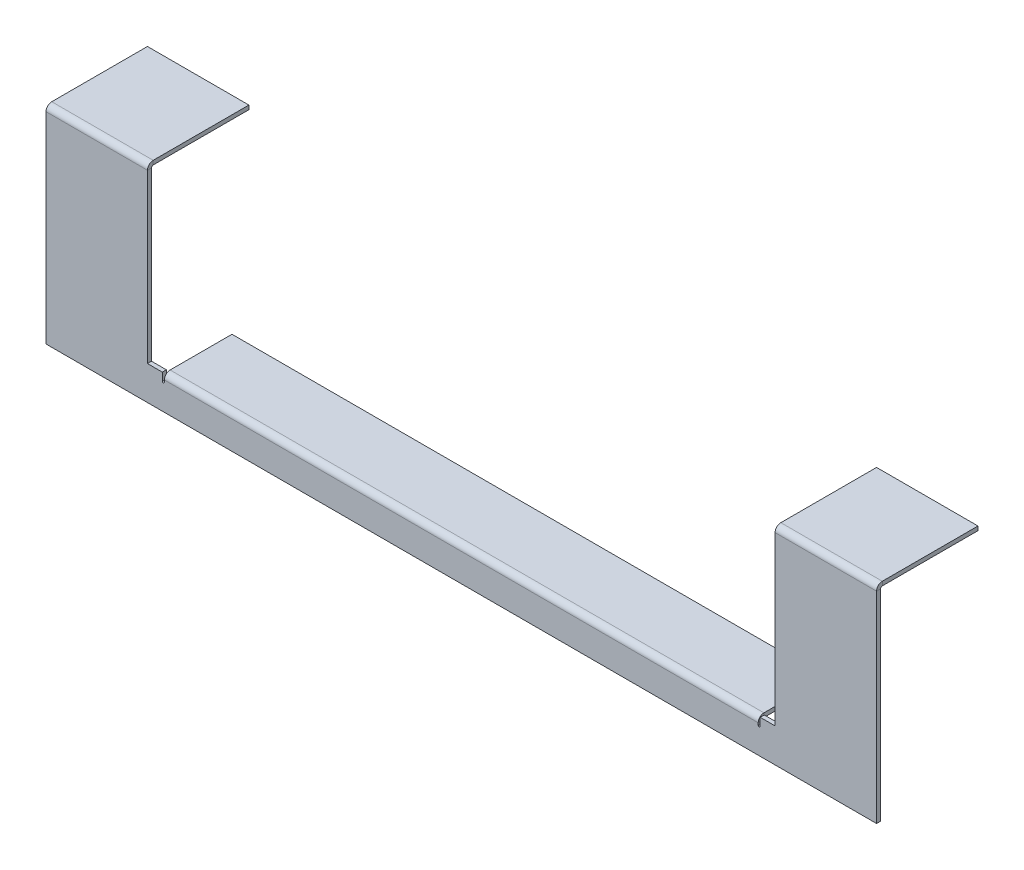
ISO-10303-21;
HEADER;
FILE_DESCRIPTION(('STEP AP214'),'2;1');
FILE_NAME('part.step','',(''),(''),'','','');
FILE_SCHEMA(('AUTOMOTIVE_DESIGN { 1 0 10303 214 1 1 1 1 }'));
ENDSEC;
DATA;
#1=APPLICATION_CONTEXT('core data for automotive mechanical design processes');
#2=APPLICATION_PROTOCOL_DEFINITION('international standard','automotive_design',2000,#1);
#3=PRODUCT_CONTEXT('',#1,'mechanical');
#4=PRODUCT('Part','Part','',(#3));
#5=PRODUCT_RELATED_PRODUCT_CATEGORY('part','',(#4));
#6=PRODUCT_DEFINITION_FORMATION('','',#4);
#7=PRODUCT_DEFINITION_CONTEXT('part definition',#1,'design');
#8=PRODUCT_DEFINITION('design','',#6,#7);
#9=PRODUCT_DEFINITION_SHAPE('','',#8);
#10=(LENGTH_UNIT() NAMED_UNIT(*) SI_UNIT(.MILLI.,.METRE.));
#11=(NAMED_UNIT(*) PLANE_ANGLE_UNIT() SI_UNIT($,.RADIAN.));
#12=(NAMED_UNIT(*) SI_UNIT($,.STERADIAN.) SOLID_ANGLE_UNIT());
#13=UNCERTAINTY_MEASURE_WITH_UNIT(LENGTH_MEASURE(1.E-05),#10,'distance_accuracy_value','');
#14=(GEOMETRIC_REPRESENTATION_CONTEXT(3) GLOBAL_UNCERTAINTY_ASSIGNED_CONTEXT((#13)) GLOBAL_UNIT_ASSIGNED_CONTEXT((#10,
#11,#12)) REPRESENTATION_CONTEXT('',''));
#15=CARTESIAN_POINT('',(0.,0.,0.));
#16=DIRECTION('',(0.,0.,1.));
#17=DIRECTION('',(1.,0.,0.));
#18=AXIS2_PLACEMENT_3D('',#15,#16,#17);
#19=CARTESIAN_POINT('',(0.,0.,-1.2));
#20=DIRECTION('',(0.,0.,1.));
#21=DIRECTION('',(1.,0.,0.));
#22=AXIS2_PLACEMENT_3D('',#19,#20,#21);
#23=PLANE('',#22);
#24=DIRECTION('',(0.,-1.,0.));
#25=VECTOR('',#24,1.);
#26=CARTESIAN_POINT('',(88.4,-20.6,-1.2));
#27=LINE('',#26,#25);
#28=CARTESIAN_POINT('',(88.4,-20.6,-1.2));
#29=VERTEX_POINT('',#28);
#30=CARTESIAN_POINT('',(88.4,-22.9,-1.2));
#31=VERTEX_POINT('',#30);
#32=EDGE_CURVE('E349',#29,#31,#27,.T.);
#33=ORIENTED_EDGE('',*,*,#32,.F.);
#34=DIRECTION('',(1.,0.,0.));
#35=VECTOR('',#34,1.);
#36=CARTESIAN_POINT('',(0.,-20.6,-1.2));
#37=LINE('',#36,#35);
#38=CARTESIAN_POINT('',(92.8,-20.6,-1.2));
#39=VERTEX_POINT('',#38);
#40=EDGE_CURVE('E506',#29,#39,#37,.T.);
#41=ORIENTED_EDGE('',*,*,#40,.T.);
#42=DIRECTION('',(0.,1.,0.));
#43=VECTOR('',#42,1.);
#44=CARTESIAN_POINT('',(92.8,0.,-1.2));
#45=LINE('',#44,#43);
#46=CARTESIAN_POINT('',(92.8,28.9,-1.19999999999999));
#47=VERTEX_POINT('',#46);
#48=EDGE_CURVE('E512',#39,#47,#45,.T.);
#49=ORIENTED_EDGE('',*,*,#48,.T.);
#50=DIRECTION('',(1.,0.,0.));
#51=VECTOR('',#50,1.);
#52=CARTESIAN_POINT('',(122.8,28.9,-1.19999999999999));
#53=LINE('',#52,#51);
#54=CARTESIAN_POINT('',(122.8,28.9,-1.19999999999999));
#55=VERTEX_POINT('',#54);
#56=EDGE_CURVE('E485',#55,#47,#53,.F.);
#57=ORIENTED_EDGE('',*,*,#56,.F.);
#58=DIRECTION('',(0.,1.,0.));
#59=VECTOR('',#58,1.);
#60=CARTESIAN_POINT('',(122.8,-30.6,-1.2));
#61=LINE('',#60,#59);
#62=CARTESIAN_POINT('',(122.8,-30.6,-1.2));
#63=VERTEX_POINT('',#62);
#64=EDGE_CURVE('E521',#63,#55,#61,.T.);
#65=ORIENTED_EDGE('',*,*,#64,.F.);
#66=DIRECTION('',(1.,0.,0.));
#67=VECTOR('',#66,1.);
#68=CARTESIAN_POINT('',(-122.8,-30.6,-1.2));
#69=LINE('',#68,#67);
#70=CARTESIAN_POINT('',(-122.8,-30.6,-1.2));
#71=VERTEX_POINT('',#70);
#72=EDGE_CURVE('E518',#71,#63,#69,.T.);
#73=ORIENTED_EDGE('',*,*,#72,.F.);
#74=DIRECTION('',(0.,-1.,0.));
#75=VECTOR('',#74,1.);
#76=CARTESIAN_POINT('',(-122.8,-30.6,-1.2));
#77=LINE('',#76,#75);
#78=CARTESIAN_POINT('',(-122.8,28.9,-1.2));
#79=VERTEX_POINT('',#78);
#80=EDGE_CURVE('E525',#79,#71,#77,.T.);
#81=ORIENTED_EDGE('',*,*,#80,.F.);
#82=DIRECTION('',(1.,0.,0.));
#83=VECTOR('',#82,1.);
#84=CARTESIAN_POINT('',(-92.8,28.9,-1.2));
#85=LINE('',#84,#83);
#86=CARTESIAN_POINT('',(-92.8,28.9,-1.2));
#87=VERTEX_POINT('',#86);
#88=EDGE_CURVE('E430',#87,#79,#85,.F.);
#89=ORIENTED_EDGE('',*,*,#88,.F.);
#90=DIRECTION('',(0.,-1.,0.));
#91=VECTOR('',#90,1.);
#92=CARTESIAN_POINT('',(-92.8,0.,-1.2));
#93=LINE('',#92,#91);
#94=CARTESIAN_POINT('',(-92.8,-20.6,-1.2));
#95=VERTEX_POINT('',#94);
#96=EDGE_CURVE('E515',#87,#95,#93,.T.);
#97=ORIENTED_EDGE('',*,*,#96,.T.);
#98=CARTESIAN_POINT('',(-88.4,-20.6,-1.2));
#99=VERTEX_POINT('',#98);
#100=EDGE_CURVE('E509',#95,#99,#37,.T.);
#101=ORIENTED_EDGE('',*,*,#100,.T.);
#102=DIRECTION('',(0.,1.,0.));
#103=VECTOR('',#102,1.);
#104=CARTESIAN_POINT('',(-88.4,-22.9,-1.2));
#105=LINE('',#104,#103);
#106=CARTESIAN_POINT('',(-88.4,-22.9,-1.2));
#107=VERTEX_POINT('',#106);
#108=EDGE_CURVE('E365',#107,#99,#105,.T.);
#109=ORIENTED_EDGE('',*,*,#108,.F.);
#110=CARTESIAN_POINT('',(-88.1,-22.9,-1.2));
#111=DIRECTION('',(0.,0.,-1.));
#112=DIRECTION('',(-1.,0.,0.));
#113=AXIS2_PLACEMENT_3D('',#110,#111,#112);
#114=CIRCLE('',#113,0.300000000000002);
#115=CARTESIAN_POINT('',(-87.8,-22.9,-1.2));
#116=VERTEX_POINT('',#115);
#117=EDGE_CURVE('E361',#116,#107,#114,.T.);
#118=ORIENTED_EDGE('',*,*,#117,.F.);
#119=DIRECTION('',(0.,-1.,0.));
#120=VECTOR('',#119,1.);
#121=CARTESIAN_POINT('',(-87.8,-22.3,-1.2));
#122=LINE('',#121,#120);
#123=CARTESIAN_POINT('',(-87.8,-22.3,-1.2));
#124=VERTEX_POINT('',#123);
#125=EDGE_CURVE('E358',#124,#116,#122,.T.);
#126=ORIENTED_EDGE('',*,*,#125,.F.);
#127=DIRECTION('',(1.,0.,0.));
#128=VECTOR('',#127,1.);
#129=CARTESIAN_POINT('',(87.8,-22.3,-1.2));
#130=LINE('',#129,#128);
#131=CARTESIAN_POINT('',(87.8,-22.3,-1.2));
#132=VERTEX_POINT('',#131);
#133=EDGE_CURVE('E338',#132,#124,#130,.F.);
#134=ORIENTED_EDGE('',*,*,#133,.F.);
#135=DIRECTION('',(0.,1.,0.));
#136=VECTOR('',#135,1.);
#137=CARTESIAN_POINT('',(87.8,-22.9,-1.2));
#138=LINE('',#137,#136);
#139=CARTESIAN_POINT('',(87.8,-22.9,-1.2));
#140=VERTEX_POINT('',#139);
#141=EDGE_CURVE('E119',#140,#132,#138,.T.);
#142=ORIENTED_EDGE('',*,*,#141,.F.);
#143=CARTESIAN_POINT('',(88.1,-22.9,-1.2));
#144=DIRECTION('',(0.,0.,-1.));
#145=DIRECTION('',(-1.,0.,0.));
#146=AXIS2_PLACEMENT_3D('',#143,#144,#145);
#147=CIRCLE('',#146,0.300000000000002);
#148=EDGE_CURVE('E114',#31,#140,#147,.T.);
#149=ORIENTED_EDGE('',*,*,#148,.F.);
#150=EDGE_LOOP('',(#33,#41,#49,#57,#65,#73,#81,#89,#97,#101,#109,#118,#126,#134,#142,#149));
#151=FACE_BOUND('',#150,.T.);
#152=ADVANCED_FACE('F99',(#151),#23,.F.);
#153=CARTESIAN_POINT('',(0.,0.,0.));
#154=DIRECTION('',(0.,0.,1.));
#155=DIRECTION('',(1.,0.,0.));
#156=AXIS2_PLACEMENT_3D('',#153,#154,#155);
#157=PLANE('',#156);
#158=DIRECTION('',(1.,0.,0.));
#159=VECTOR('',#158,1.);
#160=CARTESIAN_POINT('',(-92.8,-20.6,0.));
#161=LINE('',#160,#159);
#162=CARTESIAN_POINT('',(88.4,-20.6,0.));
#163=VERTEX_POINT('',#162);
#164=CARTESIAN_POINT('',(92.8,-20.6,0.));
#165=VERTEX_POINT('',#164);
#166=EDGE_CURVE('E496',#163,#165,#161,.T.);
#167=ORIENTED_EDGE('',*,*,#166,.F.);
#168=DIRECTION('',(0.,-1.,0.));
#169=VECTOR('',#168,1.);
#170=CARTESIAN_POINT('',(88.4,0.,0.));
#171=LINE('',#170,#169);
#172=CARTESIAN_POINT('',(88.4,-22.9,0.));
#173=VERTEX_POINT('',#172);
#174=EDGE_CURVE('E382',#163,#173,#171,.T.);
#175=ORIENTED_EDGE('',*,*,#174,.T.);
#176=CARTESIAN_POINT('',(88.1,-22.9,0.));
#177=DIRECTION('',(0.,0.,1.));
#178=DIRECTION('',(1.,0.,0.));
#179=AXIS2_PLACEMENT_3D('',#176,#177,#178);
#180=CIRCLE('',#179,0.300000000000002);
#181=CARTESIAN_POINT('',(87.8,-22.9,0.));
#182=VERTEX_POINT('',#181);
#183=EDGE_CURVE('E13',#173,#182,#180,.F.);
#184=ORIENTED_EDGE('',*,*,#183,.T.);
#185=DIRECTION('',(0.,1.,0.));
#186=VECTOR('',#185,1.);
#187=CARTESIAN_POINT('',(87.8,0.,0.));
#188=LINE('',#187,#186);
#189=CARTESIAN_POINT('',(87.8,-22.3,0.));
#190=VERTEX_POINT('',#189);
#191=EDGE_CURVE('E107',#182,#190,#188,.T.);
#192=ORIENTED_EDGE('',*,*,#191,.T.);
#193=DIRECTION('',(1.,0.,0.));
#194=VECTOR('',#193,1.);
#195=CARTESIAN_POINT('',(87.8,-22.3,0.));
#196=LINE('',#195,#194);
#197=CARTESIAN_POINT('',(-87.8,-22.3,0.));
#198=VERTEX_POINT('',#197);
#199=EDGE_CURVE('E325',#190,#198,#196,.F.);
#200=ORIENTED_EDGE('',*,*,#199,.T.);
#201=DIRECTION('',(0.,-1.,0.));
#202=VECTOR('',#201,1.);
#203=CARTESIAN_POINT('',(-87.8,0.,0.));
#204=LINE('',#203,#202);
#205=CARTESIAN_POINT('',(-87.8,-22.9,0.));
#206=VERTEX_POINT('',#205);
#207=EDGE_CURVE('E540',#198,#206,#204,.T.);
#208=ORIENTED_EDGE('',*,*,#207,.T.);
#209=CARTESIAN_POINT('',(-88.1,-22.9,0.));
#210=DIRECTION('',(0.,0.,1.));
#211=DIRECTION('',(1.,0.,0.));
#212=AXIS2_PLACEMENT_3D('',#209,#210,#211);
#213=CIRCLE('',#212,0.300000000000002);
#214=CARTESIAN_POINT('',(-88.4,-22.9,0.));
#215=VERTEX_POINT('',#214);
#216=EDGE_CURVE('E537',#206,#215,#213,.F.);
#217=ORIENTED_EDGE('',*,*,#216,.T.);
#218=DIRECTION('',(0.,1.,0.));
#219=VECTOR('',#218,1.);
#220=CARTESIAN_POINT('',(-88.4,0.,0.));
#221=LINE('',#220,#219);
#222=CARTESIAN_POINT('',(-88.4,-20.6,0.));
#223=VERTEX_POINT('',#222);
#224=EDGE_CURVE('E352',#215,#223,#221,.T.);
#225=ORIENTED_EDGE('',*,*,#224,.T.);
#226=CARTESIAN_POINT('',(-92.8,-20.6,0.));
#227=VERTEX_POINT('',#226);
#228=EDGE_CURVE('E497',#227,#223,#161,.T.);
#229=ORIENTED_EDGE('',*,*,#228,.F.);
#230=DIRECTION('',(0.,-1.,0.));
#231=VECTOR('',#230,1.);
#232=CARTESIAN_POINT('',(-92.8,30.6,0.));
#233=LINE('',#232,#231);
#234=CARTESIAN_POINT('',(-92.8,28.9,0.));
#235=VERTEX_POINT('',#234);
#236=EDGE_CURVE('E492',#235,#227,#233,.T.);
#237=ORIENTED_EDGE('',*,*,#236,.F.);
#238=DIRECTION('',(1.,0.,0.));
#239=VECTOR('',#238,1.);
#240=CARTESIAN_POINT('',(-92.8,28.9,0.));
#241=LINE('',#240,#239);
#242=CARTESIAN_POINT('',(-122.8,28.9,0.));
#243=VERTEX_POINT('',#242);
#244=EDGE_CURVE('E417',#235,#243,#241,.F.);
#245=ORIENTED_EDGE('',*,*,#244,.T.);
#246=DIRECTION('',(0.,-1.,0.));
#247=VECTOR('',#246,1.);
#248=CARTESIAN_POINT('',(-122.8,-30.6,0.));
#249=LINE('',#248,#247);
#250=CARTESIAN_POINT('',(-122.8,-30.6,0.));
#251=VERTEX_POINT('',#250);
#252=EDGE_CURVE('E522',#243,#251,#249,.T.);
#253=ORIENTED_EDGE('',*,*,#252,.T.);
#254=DIRECTION('',(1.,0.,0.));
#255=VECTOR('',#254,1.);
#256=CARTESIAN_POINT('',(-122.8,-30.6,0.));
#257=LINE('',#256,#255);
#258=CARTESIAN_POINT('',(122.8,-30.6,0.));
#259=VERTEX_POINT('',#258);
#260=EDGE_CURVE('E517',#251,#259,#257,.T.);
#261=ORIENTED_EDGE('',*,*,#260,.T.);
#262=DIRECTION('',(0.,1.,0.));
#263=VECTOR('',#262,1.);
#264=CARTESIAN_POINT('',(122.8,-30.6,0.));
#265=LINE('',#264,#263);
#266=CARTESIAN_POINT('',(122.8,28.9,0.));
#267=VERTEX_POINT('',#266);
#268=EDGE_CURVE('E530',#259,#267,#265,.T.);
#269=ORIENTED_EDGE('',*,*,#268,.T.);
#270=DIRECTION('',(1.,0.,0.));
#271=VECTOR('',#270,1.);
#272=CARTESIAN_POINT('',(122.8,28.9,0.));
#273=LINE('',#272,#271);
#274=CARTESIAN_POINT('',(92.8,28.9,0.));
#275=VERTEX_POINT('',#274);
#276=EDGE_CURVE('E472',#267,#275,#273,.F.);
#277=ORIENTED_EDGE('',*,*,#276,.T.);
#278=DIRECTION('',(0.,1.,0.));
#279=VECTOR('',#278,1.);
#280=CARTESIAN_POINT('',(92.8,-20.6,0.));
#281=LINE('',#280,#279);
#282=EDGE_CURVE('E499',#165,#275,#281,.T.);
#283=ORIENTED_EDGE('',*,*,#282,.F.);
#284=EDGE_LOOP('',(#167,#175,#184,#192,#200,#208,#217,#225,#229,#237,#245,#253,#261,#269,#277,#283));
#285=FACE_BOUND('',#284,.T.);
#286=ADVANCED_FACE('F545',(#285),#157,.T.);
#287=CARTESIAN_POINT('',(-92.8,-20.6,-10.));
#288=DIRECTION('',(0.,-1.,0.));
#289=DIRECTION('',(1.,0.,0.));
#290=AXIS2_PLACEMENT_3D('',#287,#288,#289);
#291=PLANE('',#290);
#292=DIRECTION('',(0.,0.,1.));
#293=VECTOR('',#292,1.);
#294=CARTESIAN_POINT('',(88.4,-20.6,-1.2));
#295=LINE('',#294,#293);
#296=EDGE_CURVE('E353',#29,#163,#295,.T.);
#297=ORIENTED_EDGE('',*,*,#296,.T.);
#298=ORIENTED_EDGE('',*,*,#166,.T.);
#299=DIRECTION('',(0.,0.,1.));
#300=VECTOR('',#299,1.);
#301=CARTESIAN_POINT('',(92.8,-20.6,-10.));
#302=LINE('',#301,#300);
#303=EDGE_CURVE('E503',#39,#165,#302,.T.);
#304=ORIENTED_EDGE('',*,*,#303,.F.);
#305=ORIENTED_EDGE('',*,*,#40,.F.);
#306=EDGE_LOOP('',(#297,#298,#304,#305));
#307=FACE_BOUND('',#306,.T.);
#308=ADVANCED_FACE('F586',(#307),#291,.F.);
#309=DIRECTION('',(0.,0.,1.));
#310=VECTOR('',#309,1.);
#311=CARTESIAN_POINT('',(-88.4,-20.6,-1.2));
#312=LINE('',#311,#310);
#313=EDGE_CURVE('E368',#99,#223,#312,.T.);
#314=ORIENTED_EDGE('',*,*,#313,.F.);
#315=ORIENTED_EDGE('',*,*,#100,.F.);
#316=DIRECTION('',(0.,0.,1.));
#317=VECTOR('',#316,1.);
#318=CARTESIAN_POINT('',(-92.8,-20.6,-10.));
#319=LINE('',#318,#317);
#320=EDGE_CURVE('E502',#95,#227,#319,.T.);
#321=ORIENTED_EDGE('',*,*,#320,.T.);
#322=ORIENTED_EDGE('',*,*,#228,.T.);
#323=EDGE_LOOP('',(#314,#315,#321,#322));
#324=FACE_BOUND('',#323,.T.);
#325=ADVANCED_FACE('F606',(#324),#291,.F.);
#326=CARTESIAN_POINT('',(-92.8,30.6,-10.));
#327=DIRECTION('',(-1.,0.,0.));
#328=DIRECTION('',(0.,0.,1.));
#329=AXIS2_PLACEMENT_3D('',#326,#327,#328);
#330=PLANE('',#329);
#331=DIRECTION('',(0.,0.,1.));
#332=VECTOR('',#331,1.);
#333=CARTESIAN_POINT('',(-92.8,28.9,-1.2));
#334=LINE('',#333,#332);
#335=EDGE_CURVE('E424',#87,#235,#334,.T.);
#336=ORIENTED_EDGE('',*,*,#335,.T.);
#337=ORIENTED_EDGE('',*,*,#236,.T.);
#338=ORIENTED_EDGE('',*,*,#320,.F.);
#339=ORIENTED_EDGE('',*,*,#96,.F.);
#340=EDGE_LOOP('',(#336,#337,#338,#339));
#341=FACE_BOUND('',#340,.T.);
#342=ADVANCED_FACE('F589',(#341),#330,.F.);
#343=CARTESIAN_POINT('',(122.8,-30.6,-1.2));
#344=DIRECTION('',(1.,0.,0.));
#345=DIRECTION('',(0.,0.,-1.));
#346=AXIS2_PLACEMENT_3D('',#343,#344,#345);
#347=PLANE('',#346);
#348=ORIENTED_EDGE('',*,*,#64,.T.);
#349=DIRECTION('',(0.,0.,1.));
#350=VECTOR('',#349,1.);
#351=CARTESIAN_POINT('',(122.8,28.9,-1.19999999999999));
#352=LINE('',#351,#350);
#353=EDGE_CURVE('E479',#55,#267,#352,.T.);
#354=ORIENTED_EDGE('',*,*,#353,.T.);
#355=ORIENTED_EDGE('',*,*,#268,.F.);
#356=DIRECTION('',(0.,0.,1.));
#357=VECTOR('',#356,1.);
#358=CARTESIAN_POINT('',(122.8,-30.6,-1.2));
#359=LINE('',#358,#357);
#360=EDGE_CURVE('E527',#63,#259,#359,.T.);
#361=ORIENTED_EDGE('',*,*,#360,.F.);
#362=EDGE_LOOP('',(#348,#354,#355,#361));
#363=FACE_BOUND('',#362,.T.);
#364=ADVANCED_FACE('F596',(#363),#347,.T.);
#365=CARTESIAN_POINT('',(92.8,-20.6,-10.));
#366=DIRECTION('',(1.,0.,0.));
#367=DIRECTION('',(0.,0.,-1.));
#368=AXIS2_PLACEMENT_3D('',#365,#366,#367);
#369=PLANE('',#368);
#370=DIRECTION('',(0.,0.,1.));
#371=VECTOR('',#370,1.);
#372=CARTESIAN_POINT('',(92.8,28.9,-1.19999999999999));
#373=LINE('',#372,#371);
#374=EDGE_CURVE('E489',#47,#275,#373,.T.);
#375=ORIENTED_EDGE('',*,*,#374,.F.);
#376=ORIENTED_EDGE('',*,*,#48,.F.);
#377=ORIENTED_EDGE('',*,*,#303,.T.);
#378=ORIENTED_EDGE('',*,*,#282,.T.);
#379=EDGE_LOOP('',(#375,#376,#377,#378));
#380=FACE_BOUND('',#379,.T.);
#381=ADVANCED_FACE('F598',(#380),#369,.F.);
#382=CARTESIAN_POINT('',(-122.8,-30.6,-1.2));
#383=DIRECTION('',(0.,-1.,0.));
#384=DIRECTION('',(1.,0.,0.));
#385=AXIS2_PLACEMENT_3D('',#382,#383,#384);
#386=PLANE('',#385);
#387=ORIENTED_EDGE('',*,*,#260,.F.);
#388=DIRECTION('',(0.,0.,1.));
#389=VECTOR('',#388,1.);
#390=CARTESIAN_POINT('',(-122.8,-30.6,-1.2));
#391=LINE('',#390,#389);
#392=EDGE_CURVE('E534',#71,#251,#391,.T.);
#393=ORIENTED_EDGE('',*,*,#392,.F.);
#394=ORIENTED_EDGE('',*,*,#72,.T.);
#395=ORIENTED_EDGE('',*,*,#360,.T.);
#396=EDGE_LOOP('',(#387,#393,#394,#395));
#397=FACE_BOUND('',#396,.T.);
#398=ADVANCED_FACE('F101',(#397),#386,.T.);
#399=CARTESIAN_POINT('',(-122.8,-30.6,-1.2));
#400=DIRECTION('',(-1.,0.,0.));
#401=DIRECTION('',(0.,0.,1.));
#402=AXIS2_PLACEMENT_3D('',#399,#400,#401);
#403=PLANE('',#402);
#404=DIRECTION('',(0.,0.,1.));
#405=VECTOR('',#404,1.);
#406=CARTESIAN_POINT('',(-122.8,28.9,-1.2));
#407=LINE('',#406,#405);
#408=EDGE_CURVE('E434',#79,#243,#407,.T.);
#409=ORIENTED_EDGE('',*,*,#408,.F.);
#410=ORIENTED_EDGE('',*,*,#80,.T.);
#411=ORIENTED_EDGE('',*,*,#392,.T.);
#412=ORIENTED_EDGE('',*,*,#252,.F.);
#413=EDGE_LOOP('',(#409,#410,#411,#412));
#414=FACE_BOUND('',#413,.T.);
#415=ADVANCED_FACE('F592',(#414),#403,.T.);
#416=CARTESIAN_POINT('',(92.8,28.9,-1.69999999999999));
#417=DIRECTION('',(-1.,0.,0.));
#418=DIRECTION('',(0.,0.,1.));
#419=AXIS2_PLACEMENT_3D('',#416,#417,#418);
#420=PLANE('',#419);
#421=DIRECTION('',(0.,1.,0.));
#422=VECTOR('',#421,1.);
#423=CARTESIAN_POINT('',(92.8,30.6,-1.69999999999999));
#424=LINE('',#423,#422);
#425=CARTESIAN_POINT('',(92.8,29.4,-1.69999999999999));
#426=VERTEX_POINT('',#425);
#427=CARTESIAN_POINT('',(92.8,30.6,-1.69999999999999));
#428=VERTEX_POINT('',#427);
#429=EDGE_CURVE('E437',#426,#428,#424,.T.);
#430=ORIENTED_EDGE('',*,*,#429,.F.);
#431=CARTESIAN_POINT('',(92.8,28.9,-1.69999999999999));
#432=DIRECTION('',(1.,0.,0.));
#433=DIRECTION('',(0.,0.,-1.));
#434=AXIS2_PLACEMENT_3D('',#431,#432,#433);
#435=CIRCLE('',#434,0.5);
#436=EDGE_CURVE('E482',#47,#426,#435,.F.);
#437=ORIENTED_EDGE('',*,*,#436,.F.);
#438=ORIENTED_EDGE('',*,*,#374,.T.);
#439=CARTESIAN_POINT('',(92.8,28.9,-1.69999999999999));
#440=DIRECTION('',(1.,0.,0.));
#441=DIRECTION('',(0.,0.,-1.));
#442=AXIS2_PLACEMENT_3D('',#439,#440,#441);
#443=CIRCLE('',#442,1.7);
#444=EDGE_CURVE('E475',#275,#428,#443,.F.);
#445=ORIENTED_EDGE('',*,*,#444,.T.);
#446=EDGE_LOOP('',(#430,#437,#438,#445));
#447=FACE_BOUND('',#446,.T.);
#448=ADVANCED_FACE('F594',(#447),#420,.T.);
#449=CARTESIAN_POINT('',(122.8,28.9,-1.69999999999999));
#450=DIRECTION('',(-1.,0.,0.));
#451=DIRECTION('',(0.,0.,1.));
#452=AXIS2_PLACEMENT_3D('',#449,#450,#451);
#453=PLANE('',#452);
#454=CARTESIAN_POINT('',(122.8,28.9,-1.69999999999999));
#455=DIRECTION('',(1.,0.,0.));
#456=DIRECTION('',(0.,0.,-1.));
#457=AXIS2_PLACEMENT_3D('',#454,#455,#456);
#458=CIRCLE('',#457,0.5);
#459=CARTESIAN_POINT('',(122.8,29.4,-1.69999999999999));
#460=VERTEX_POINT('',#459);
#461=EDGE_CURVE('E442',#460,#55,#458,.T.);
#462=ORIENTED_EDGE('',*,*,#461,.F.);
#463=DIRECTION('',(0.,1.,0.));
#464=VECTOR('',#463,1.);
#465=CARTESIAN_POINT('',(122.8,29.4,-1.69999999999999));
#466=LINE('',#465,#464);
#467=CARTESIAN_POINT('',(122.8,30.6,-1.69999999999999));
#468=VERTEX_POINT('',#467);
#469=EDGE_CURVE('E465',#460,#468,#466,.T.);
#470=ORIENTED_EDGE('',*,*,#469,.T.);
#471=CARTESIAN_POINT('',(122.8,28.9,-1.69999999999999));
#472=DIRECTION('',(1.,0.,0.));
#473=DIRECTION('',(0.,0.,-1.));
#474=AXIS2_PLACEMENT_3D('',#471,#472,#473);
#475=CIRCLE('',#474,1.7);
#476=EDGE_CURVE('E476',#468,#267,#475,.T.);
#477=ORIENTED_EDGE('',*,*,#476,.T.);
#478=ORIENTED_EDGE('',*,*,#353,.F.);
#479=EDGE_LOOP('',(#462,#470,#477,#478));
#480=FACE_BOUND('',#479,.T.);
#481=ADVANCED_FACE('F722',(#480),#453,.F.);
#482=CARTESIAN_POINT('',(122.8,28.9,-1.69999999999999));
#483=DIRECTION('',(1.,0.,0.));
#484=DIRECTION('',(0.,1.,0.));
#485=AXIS2_PLACEMENT_3D('',#482,#483,#484);
#486=CYLINDRICAL_SURFACE('',#485,1.7);
#487=ORIENTED_EDGE('',*,*,#276,.F.);
#488=ORIENTED_EDGE('',*,*,#476,.F.);
#489=DIRECTION('',(1.,0.,0.));
#490=VECTOR('',#489,1.);
#491=CARTESIAN_POINT('',(0.,30.6,-1.69999999999999));
#492=LINE('',#491,#490);
#493=EDGE_CURVE('E462',#428,#468,#492,.T.);
#494=ORIENTED_EDGE('',*,*,#493,.F.);
#495=ORIENTED_EDGE('',*,*,#444,.F.);
#496=EDGE_LOOP('',(#487,#488,#494,#495));
#497=FACE_BOUND('',#496,.T.);
#498=ADVANCED_FACE('F719',(#497),#486,.T.);
#499=CARTESIAN_POINT('',(122.8,28.9,-1.69999999999999));
#500=DIRECTION('',(1.,0.,0.));
#501=DIRECTION('',(0.,1.,0.));
#502=AXIS2_PLACEMENT_3D('',#499,#500,#501);
#503=CYLINDRICAL_SURFACE('',#502,0.5);
#504=ORIENTED_EDGE('',*,*,#56,.T.);
#505=ORIENTED_EDGE('',*,*,#436,.T.);
#506=DIRECTION('',(-1.,0.,0.));
#507=VECTOR('',#506,1.);
#508=CARTESIAN_POINT('',(92.8,29.4,-1.69999999999999));
#509=LINE('',#508,#507);
#510=EDGE_CURVE('E468',#426,#460,#509,.F.);
#511=ORIENTED_EDGE('',*,*,#510,.T.);
#512=ORIENTED_EDGE('',*,*,#461,.T.);
#513=EDGE_LOOP('',(#504,#505,#511,#512));
#514=FACE_BOUND('',#513,.T.);
#515=ADVANCED_FACE('F711',(#514),#503,.F.);
#516=CARTESIAN_POINT('',(122.8,30.6,-1.2));
#517=DIRECTION('',(1.,0.,0.));
#518=DIRECTION('',(0.,1.,0.));
#519=AXIS2_PLACEMENT_3D('',#516,#517,#518);
#520=PLANE('',#519);
#521=DIRECTION('',(0.,0.,1.));
#522=VECTOR('',#521,1.);
#523=CARTESIAN_POINT('',(122.8,30.6,-1.2));
#524=LINE('',#523,#522);
#525=CARTESIAN_POINT('',(122.8,30.6000000000001,-30.));
#526=VERTEX_POINT('',#525);
#527=EDGE_CURVE('E446',#526,#468,#524,.T.);
#528=ORIENTED_EDGE('',*,*,#527,.T.);
#529=ORIENTED_EDGE('',*,*,#469,.F.);
#530=DIRECTION('',(0.,0.,-1.));
#531=VECTOR('',#530,1.);
#532=CARTESIAN_POINT('',(122.8,29.4,1.06902334207071E-13));
#533=LINE('',#532,#531);
#534=CARTESIAN_POINT('',(122.8,29.4000000000001,-30.));
#535=VERTEX_POINT('',#534);
#536=EDGE_CURVE('E454',#535,#460,#533,.F.);
#537=ORIENTED_EDGE('',*,*,#536,.F.);
#538=DIRECTION('',(0.,-1.,0.));
#539=VECTOR('',#538,1.);
#540=CARTESIAN_POINT('',(122.8,30.6000000000001,-30.));
#541=LINE('',#540,#539);
#542=EDGE_CURVE('E440',#526,#535,#541,.T.);
#543=ORIENTED_EDGE('',*,*,#542,.F.);
#544=EDGE_LOOP('',(#528,#529,#537,#543));
#545=FACE_BOUND('',#544,.T.);
#546=ADVANCED_FACE('F708',(#545),#520,.T.);
#547=CARTESIAN_POINT('',(92.8,30.6000000000001,-30.));
#548=DIRECTION('',(-1.,0.,0.));
#549=DIRECTION('',(0.,-1.,0.));
#550=AXIS2_PLACEMENT_3D('',#547,#548,#549);
#551=PLANE('',#550);
#552=DIRECTION('',(0.,0.,1.));
#553=VECTOR('',#552,1.);
#554=CARTESIAN_POINT('',(92.8,29.4,1.06902334207071E-13));
#555=LINE('',#554,#553);
#556=CARTESIAN_POINT('',(92.8,29.4000000000001,-30.));
#557=VERTEX_POINT('',#556);
#558=EDGE_CURVE('E460',#426,#557,#555,.F.);
#559=ORIENTED_EDGE('',*,*,#558,.F.);
#560=ORIENTED_EDGE('',*,*,#429,.T.);
#561=DIRECTION('',(0.,0.,-1.));
#562=VECTOR('',#561,1.);
#563=CARTESIAN_POINT('',(92.8,30.6000000000001,-30.));
#564=LINE('',#563,#562);
#565=CARTESIAN_POINT('',(92.8,30.6000000000001,-30.));
#566=VERTEX_POINT('',#565);
#567=EDGE_CURVE('E452',#428,#566,#564,.T.);
#568=ORIENTED_EDGE('',*,*,#567,.T.);
#569=DIRECTION('',(0.,-1.,0.));
#570=VECTOR('',#569,1.);
#571=CARTESIAN_POINT('',(92.8,30.6000000000001,-30.));
#572=LINE('',#571,#570);
#573=EDGE_CURVE('E443',#566,#557,#572,.T.);
#574=ORIENTED_EDGE('',*,*,#573,.T.);
#575=EDGE_LOOP('',(#559,#560,#568,#574));
#576=FACE_BOUND('',#575,.T.);
#577=ADVANCED_FACE('F703',(#576),#551,.T.);
#578=CARTESIAN_POINT('',(0.,30.6,1.11092111813683E-13));
#579=DIRECTION('',(0.,1.,0.));
#580=DIRECTION('',(0.,0.,1.));
#581=AXIS2_PLACEMENT_3D('',#578,#579,#580);
#582=PLANE('',#581);
#583=ORIENTED_EDGE('',*,*,#567,.F.);
#584=ORIENTED_EDGE('',*,*,#493,.T.);
#585=ORIENTED_EDGE('',*,*,#527,.F.);
#586=DIRECTION('',(1.,0.,0.));
#587=VECTOR('',#586,1.);
#588=CARTESIAN_POINT('',(122.8,30.6000000000001,-30.));
#589=LINE('',#588,#587);
#590=EDGE_CURVE('E449',#566,#526,#589,.T.);
#591=ORIENTED_EDGE('',*,*,#590,.F.);
#592=EDGE_LOOP('',(#583,#584,#585,#591));
#593=FACE_BOUND('',#592,.T.);
#594=ADVANCED_FACE('F699',(#593),#582,.T.);
#595=CARTESIAN_POINT('',(0.,29.4,1.06902334207071E-13));
#596=DIRECTION('',(0.,1.,0.));
#597=DIRECTION('',(0.,0.,1.));
#598=AXIS2_PLACEMENT_3D('',#595,#596,#597);
#599=PLANE('',#598);
#600=ORIENTED_EDGE('',*,*,#510,.F.);
#601=ORIENTED_EDGE('',*,*,#558,.T.);
#602=DIRECTION('',(-1.,0.,0.));
#603=VECTOR('',#602,1.);
#604=CARTESIAN_POINT('',(0.,29.4000000000001,-30.));
#605=LINE('',#604,#603);
#606=EDGE_CURVE('E457',#557,#535,#605,.F.);
#607=ORIENTED_EDGE('',*,*,#606,.T.);
#608=ORIENTED_EDGE('',*,*,#536,.T.);
#609=EDGE_LOOP('',(#600,#601,#607,#608));
#610=FACE_BOUND('',#609,.T.);
#611=ADVANCED_FACE('F702',(#610),#599,.F.);
#612=CARTESIAN_POINT('',(122.8,30.6000000000001,-30.));
#613=DIRECTION('',(0.,0.,-1.));
#614=DIRECTION('',(0.,1.,0.));
#615=AXIS2_PLACEMENT_3D('',#612,#613,#614);
#616=PLANE('',#615);
#617=ORIENTED_EDGE('',*,*,#606,.F.);
#618=ORIENTED_EDGE('',*,*,#573,.F.);
#619=ORIENTED_EDGE('',*,*,#590,.T.);
#620=ORIENTED_EDGE('',*,*,#542,.T.);
#621=EDGE_LOOP('',(#617,#618,#619,#620));
#622=FACE_BOUND('',#621,.T.);
#623=ADVANCED_FACE('F696',(#622),#616,.T.);
#624=CARTESIAN_POINT('',(-122.8,28.9,-1.7));
#625=DIRECTION('',(-1.,0.,0.));
#626=DIRECTION('',(0.,0.,1.));
#627=AXIS2_PLACEMENT_3D('',#624,#625,#626);
#628=PLANE('',#627);
#629=DIRECTION('',(0.,1.,0.));
#630=VECTOR('',#629,1.);
#631=CARTESIAN_POINT('',(-122.8,30.6,-1.7));
#632=LINE('',#631,#630);
#633=CARTESIAN_POINT('',(-122.8,29.4,-1.7));
#634=VERTEX_POINT('',#633);
#635=CARTESIAN_POINT('',(-122.8,30.6,-1.7));
#636=VERTEX_POINT('',#635);
#637=EDGE_CURVE('E384',#634,#636,#632,.T.);
#638=ORIENTED_EDGE('',*,*,#637,.F.);
#639=CARTESIAN_POINT('',(-122.8,28.9,-1.7));
#640=DIRECTION('',(1.,0.,0.));
#641=DIRECTION('',(0.,0.,-1.));
#642=AXIS2_PLACEMENT_3D('',#639,#640,#641);
#643=CIRCLE('',#642,0.5);
#644=EDGE_CURVE('E427',#79,#634,#643,.F.);
#645=ORIENTED_EDGE('',*,*,#644,.F.);
#646=ORIENTED_EDGE('',*,*,#408,.T.);
#647=CARTESIAN_POINT('',(-122.8,28.9,-1.7));
#648=DIRECTION('',(1.,0.,0.));
#649=DIRECTION('',(0.,0.,-1.));
#650=AXIS2_PLACEMENT_3D('',#647,#648,#649);
#651=CIRCLE('',#650,1.7);
#652=EDGE_CURVE('E420',#243,#636,#651,.F.);
#653=ORIENTED_EDGE('',*,*,#652,.T.);
#654=EDGE_LOOP('',(#638,#645,#646,#653));
#655=FACE_BOUND('',#654,.T.);
#656=ADVANCED_FACE('F627',(#655),#628,.T.);
#657=CARTESIAN_POINT('',(-92.8,28.9,-1.7));
#658=DIRECTION('',(-1.,0.,0.));
#659=DIRECTION('',(0.,0.,1.));
#660=AXIS2_PLACEMENT_3D('',#657,#658,#659);
#661=PLANE('',#660);
#662=CARTESIAN_POINT('',(-92.8,28.9,-1.7));
#663=DIRECTION('',(1.,0.,0.));
#664=DIRECTION('',(0.,0.,-1.));
#665=AXIS2_PLACEMENT_3D('',#662,#663,#664);
#666=CIRCLE('',#665,0.5);
#667=CARTESIAN_POINT('',(-92.8,29.4,-1.7));
#668=VERTEX_POINT('',#667);
#669=EDGE_CURVE('E387',#668,#87,#666,.T.);
#670=ORIENTED_EDGE('',*,*,#669,.F.);
#671=DIRECTION('',(0.,1.,0.));
#672=VECTOR('',#671,1.);
#673=CARTESIAN_POINT('',(-92.8,29.4,-1.7));
#674=LINE('',#673,#672);
#675=CARTESIAN_POINT('',(-92.8,30.6,-1.7));
#676=VERTEX_POINT('',#675);
#677=EDGE_CURVE('E410',#668,#676,#674,.T.);
#678=ORIENTED_EDGE('',*,*,#677,.T.);
#679=CARTESIAN_POINT('',(-92.8,28.9,-1.7));
#680=DIRECTION('',(1.,0.,0.));
#681=DIRECTION('',(0.,0.,-1.));
#682=AXIS2_PLACEMENT_3D('',#679,#680,#681);
#683=CIRCLE('',#682,1.7);
#684=EDGE_CURVE('E421',#676,#235,#683,.T.);
#685=ORIENTED_EDGE('',*,*,#684,.T.);
#686=ORIENTED_EDGE('',*,*,#335,.F.);
#687=EDGE_LOOP('',(#670,#678,#685,#686));
#688=FACE_BOUND('',#687,.T.);
#689=ADVANCED_FACE('F647',(#688),#661,.F.);
#690=CARTESIAN_POINT('',(-92.8,28.9,-1.7));
#691=DIRECTION('',(1.,0.,0.));
#692=DIRECTION('',(0.,1.,0.));
#693=AXIS2_PLACEMENT_3D('',#690,#691,#692);
#694=CYLINDRICAL_SURFACE('',#693,1.7);
#695=ORIENTED_EDGE('',*,*,#244,.F.);
#696=ORIENTED_EDGE('',*,*,#684,.F.);
#697=DIRECTION('',(1.,0.,0.));
#698=VECTOR('',#697,1.);
#699=CARTESIAN_POINT('',(0.,30.6,-1.7));
#700=LINE('',#699,#698);
#701=EDGE_CURVE('E407',#636,#676,#700,.T.);
#702=ORIENTED_EDGE('',*,*,#701,.F.);
#703=ORIENTED_EDGE('',*,*,#652,.F.);
#704=EDGE_LOOP('',(#695,#696,#702,#703));
#705=FACE_BOUND('',#704,.T.);
#706=ADVANCED_FACE('F688',(#705),#694,.T.);
#707=CARTESIAN_POINT('',(-92.8,28.9,-1.7));
#708=DIRECTION('',(1.,0.,0.));
#709=DIRECTION('',(0.,1.,0.));
#710=AXIS2_PLACEMENT_3D('',#707,#708,#709);
#711=CYLINDRICAL_SURFACE('',#710,0.5);
#712=ORIENTED_EDGE('',*,*,#88,.T.);
#713=ORIENTED_EDGE('',*,*,#644,.T.);
#714=DIRECTION('',(-1.,0.,0.));
#715=VECTOR('',#714,1.);
#716=CARTESIAN_POINT('',(-122.8,29.4,-1.7));
#717=LINE('',#716,#715);
#718=EDGE_CURVE('E413',#634,#668,#717,.F.);
#719=ORIENTED_EDGE('',*,*,#718,.T.);
#720=ORIENTED_EDGE('',*,*,#669,.T.);
#721=EDGE_LOOP('',(#712,#713,#719,#720));
#722=FACE_BOUND('',#721,.T.);
#723=ADVANCED_FACE('F623',(#722),#711,.F.);
#724=CARTESIAN_POINT('',(-92.8,30.6,-1.2));
#725=DIRECTION('',(1.,0.,0.));
#726=DIRECTION('',(0.,1.,0.));
#727=AXIS2_PLACEMENT_3D('',#724,#725,#726);
#728=PLANE('',#727);
#729=DIRECTION('',(0.,0.,1.));
#730=VECTOR('',#729,1.);
#731=CARTESIAN_POINT('',(-92.8,30.6,-1.2));
#732=LINE('',#731,#730);
#733=CARTESIAN_POINT('',(-92.8,30.6000000000001,-30.));
#734=VERTEX_POINT('',#733);
#735=EDGE_CURVE('E391',#734,#676,#732,.T.);
#736=ORIENTED_EDGE('',*,*,#735,.T.);
#737=ORIENTED_EDGE('',*,*,#677,.F.);
#738=DIRECTION('',(0.,0.,-1.));
#739=VECTOR('',#738,1.);
#740=CARTESIAN_POINT('',(-92.8,29.4,1.06902334207071E-13));
#741=LINE('',#740,#739);
#742=CARTESIAN_POINT('',(-92.8,29.4000000000001,-30.));
#743=VERTEX_POINT('',#742);
#744=EDGE_CURVE('E399',#743,#668,#741,.F.);
#745=ORIENTED_EDGE('',*,*,#744,.F.);
#746=DIRECTION('',(0.,-1.,0.));
#747=VECTOR('',#746,1.);
#748=CARTESIAN_POINT('',(-92.8,30.6000000000001,-30.));
#749=LINE('',#748,#747);
#750=EDGE_CURVE('E385',#734,#743,#749,.T.);
#751=ORIENTED_EDGE('',*,*,#750,.F.);
#752=EDGE_LOOP('',(#736,#737,#745,#751));
#753=FACE_BOUND('',#752,.T.);
#754=ADVANCED_FACE('F645',(#753),#728,.T.);
#755=CARTESIAN_POINT('',(-122.8,30.6000000000001,-30.));
#756=DIRECTION('',(-1.,0.,0.));
#757=DIRECTION('',(0.,-1.,0.));
#758=AXIS2_PLACEMENT_3D('',#755,#756,#757);
#759=PLANE('',#758);
#760=DIRECTION('',(0.,0.,1.));
#761=VECTOR('',#760,1.);
#762=CARTESIAN_POINT('',(-122.8,29.4,1.06902334207071E-13));
#763=LINE('',#762,#761);
#764=CARTESIAN_POINT('',(-122.8,29.4000000000001,-30.));
#765=VERTEX_POINT('',#764);
#766=EDGE_CURVE('E405',#634,#765,#763,.F.);
#767=ORIENTED_EDGE('',*,*,#766,.F.);
#768=ORIENTED_EDGE('',*,*,#637,.T.);
#769=DIRECTION('',(0.,0.,-1.));
#770=VECTOR('',#769,1.);
#771=CARTESIAN_POINT('',(-122.8,30.6000000000001,-30.));
#772=LINE('',#771,#770);
#773=CARTESIAN_POINT('',(-122.8,30.6000000000001,-30.));
#774=VERTEX_POINT('',#773);
#775=EDGE_CURVE('E397',#636,#774,#772,.T.);
#776=ORIENTED_EDGE('',*,*,#775,.T.);
#777=DIRECTION('',(0.,-1.,0.));
#778=VECTOR('',#777,1.);
#779=CARTESIAN_POINT('',(-122.8,30.6000000000001,-30.));
#780=LINE('',#779,#778);
#781=EDGE_CURVE('E388',#774,#765,#780,.T.);
#782=ORIENTED_EDGE('',*,*,#781,.T.);
#783=EDGE_LOOP('',(#767,#768,#776,#782));
#784=FACE_BOUND('',#783,.T.);
#785=ADVANCED_FACE('F631',(#784),#759,.T.);
#786=CARTESIAN_POINT('',(0.,30.6,1.11092111813682E-13));
#787=DIRECTION('',(0.,1.,0.));
#788=DIRECTION('',(0.,0.,1.));
#789=AXIS2_PLACEMENT_3D('',#786,#787,#788);
#790=PLANE('',#789);
#791=ORIENTED_EDGE('',*,*,#775,.F.);
#792=ORIENTED_EDGE('',*,*,#701,.T.);
#793=ORIENTED_EDGE('',*,*,#735,.F.);
#794=DIRECTION('',(1.,0.,0.));
#795=VECTOR('',#794,1.);
#796=CARTESIAN_POINT('',(-92.8,30.6000000000001,-30.));
#797=LINE('',#796,#795);
#798=EDGE_CURVE('E394',#774,#734,#797,.T.);
#799=ORIENTED_EDGE('',*,*,#798,.F.);
#800=EDGE_LOOP('',(#791,#792,#793,#799));
#801=FACE_BOUND('',#800,.T.);
#802=ADVANCED_FACE('F635',(#801),#790,.T.);
#803=CARTESIAN_POINT('',(0.,29.4,1.06902334207071E-13));
#804=DIRECTION('',(0.,1.,0.));
#805=DIRECTION('',(0.,0.,1.));
#806=AXIS2_PLACEMENT_3D('',#803,#804,#805);
#807=PLANE('',#806);
#808=ORIENTED_EDGE('',*,*,#718,.F.);
#809=ORIENTED_EDGE('',*,*,#766,.T.);
#810=DIRECTION('',(-1.,0.,0.));
#811=VECTOR('',#810,1.);
#812=CARTESIAN_POINT('',(0.,29.4000000000001,-30.));
#813=LINE('',#812,#811);
#814=EDGE_CURVE('E402',#765,#743,#813,.F.);
#815=ORIENTED_EDGE('',*,*,#814,.T.);
#816=ORIENTED_EDGE('',*,*,#744,.T.);
#817=EDGE_LOOP('',(#808,#809,#815,#816));
#818=FACE_BOUND('',#817,.T.);
#819=ADVANCED_FACE('F642',(#818),#807,.F.);
#820=CARTESIAN_POINT('',(-92.8,30.6000000000001,-30.));
#821=DIRECTION('',(0.,0.,-1.));
#822=DIRECTION('',(0.,1.,0.));
#823=AXIS2_PLACEMENT_3D('',#820,#821,#822);
#824=PLANE('',#823);
#825=ORIENTED_EDGE('',*,*,#814,.F.);
#826=ORIENTED_EDGE('',*,*,#781,.F.);
#827=ORIENTED_EDGE('',*,*,#798,.T.);
#828=ORIENTED_EDGE('',*,*,#750,.T.);
#829=EDGE_LOOP('',(#825,#826,#827,#828));
#830=FACE_BOUND('',#829,.T.);
#831=ADVANCED_FACE('F639',(#830),#824,.T.);
#832=CARTESIAN_POINT('',(88.4,-20.6,-1.2));
#833=DIRECTION('',(-1.,0.,0.));
#834=DIRECTION('',(0.,0.,1.));
#835=AXIS2_PLACEMENT_3D('',#832,#833,#834);
#836=PLANE('',#835);
#837=ORIENTED_EDGE('',*,*,#174,.F.);
#838=ORIENTED_EDGE('',*,*,#296,.F.);
#839=ORIENTED_EDGE('',*,*,#32,.T.);
#840=DIRECTION('',(0.,0.,1.));
#841=VECTOR('',#840,1.);
#842=CARTESIAN_POINT('',(88.4,-22.9,-1.2));
#843=LINE('',#842,#841);
#844=EDGE_CURVE('E355',#31,#173,#843,.T.);
#845=ORIENTED_EDGE('',*,*,#844,.T.);
#846=EDGE_LOOP('',(#837,#838,#839,#845));
#847=FACE_BOUND('',#846,.T.);
#848=ADVANCED_FACE('F673',(#847),#836,.T.);
#849=CARTESIAN_POINT('',(88.1,-22.9,-1.2));
#850=DIRECTION('',(0.,0.,1.));
#851=DIRECTION('',(1.,0.,0.));
#852=AXIS2_PLACEMENT_3D('',#849,#850,#851);
#853=CYLINDRICAL_SURFACE('',#852,0.300000000000002);
#854=ORIENTED_EDGE('',*,*,#183,.F.);
#855=ORIENTED_EDGE('',*,*,#844,.F.);
#856=ORIENTED_EDGE('',*,*,#148,.T.);
#857=DIRECTION('',(0.,0.,1.));
#858=VECTOR('',#857,1.);
#859=CARTESIAN_POINT('',(87.8,-22.9,-1.2));
#860=LINE('',#859,#858);
#861=EDGE_CURVE('E357',#140,#182,#860,.T.);
#862=ORIENTED_EDGE('',*,*,#861,.T.);
#863=EDGE_LOOP('',(#854,#855,#856,#862));
#864=FACE_BOUND('',#863,.T.);
#865=ADVANCED_FACE('F670',(#864),#853,.F.);
#866=CARTESIAN_POINT('',(87.8,-22.9,-1.2));
#867=DIRECTION('',(1.,0.,0.));
#868=DIRECTION('',(0.,0.,-1.));
#869=AXIS2_PLACEMENT_3D('',#866,#867,#868);
#870=PLANE('',#869);
#871=ORIENTED_EDGE('',*,*,#191,.F.);
#872=ORIENTED_EDGE('',*,*,#861,.F.);
#873=ORIENTED_EDGE('',*,*,#141,.T.);
#874=DIRECTION('',(0.,0.,1.));
#875=VECTOR('',#874,1.);
#876=CARTESIAN_POINT('',(87.8,-22.3,-1.2));
#877=LINE('',#876,#875);
#878=EDGE_CURVE('E332',#132,#190,#877,.T.);
#879=ORIENTED_EDGE('',*,*,#878,.T.);
#880=EDGE_LOOP('',(#871,#872,#873,#879));
#881=FACE_BOUND('',#880,.T.);
#882=ADVANCED_FACE('F549',(#881),#870,.T.);
#883=CARTESIAN_POINT('',(-87.8,-22.3,-1.2));
#884=DIRECTION('',(-1.,0.,0.));
#885=DIRECTION('',(0.,0.,1.));
#886=AXIS2_PLACEMENT_3D('',#883,#884,#885);
#887=PLANE('',#886);
#888=ORIENTED_EDGE('',*,*,#207,.F.);
#889=DIRECTION('',(0.,0.,1.));
#890=VECTOR('',#889,1.);
#891=CARTESIAN_POINT('',(-87.8,-22.3,-1.2));
#892=LINE('',#891,#890);
#893=EDGE_CURVE('E343',#124,#198,#892,.T.);
#894=ORIENTED_EDGE('',*,*,#893,.F.);
#895=ORIENTED_EDGE('',*,*,#125,.T.);
#896=DIRECTION('',(0.,0.,1.));
#897=VECTOR('',#896,1.);
#898=CARTESIAN_POINT('',(-87.8,-22.9,-1.2));
#899=LINE('',#898,#897);
#900=EDGE_CURVE('E364',#116,#206,#899,.T.);
#901=ORIENTED_EDGE('',*,*,#900,.T.);
#902=EDGE_LOOP('',(#888,#894,#895,#901));
#903=FACE_BOUND('',#902,.T.);
#904=ADVANCED_FACE('F562',(#903),#887,.T.);
#905=CARTESIAN_POINT('',(-88.1,-22.9,-1.2));
#906=DIRECTION('',(0.,0.,1.));
#907=DIRECTION('',(1.,0.,0.));
#908=AXIS2_PLACEMENT_3D('',#905,#906,#907);
#909=CYLINDRICAL_SURFACE('',#908,0.300000000000002);
#910=ORIENTED_EDGE('',*,*,#216,.F.);
#911=ORIENTED_EDGE('',*,*,#900,.F.);
#912=ORIENTED_EDGE('',*,*,#117,.T.);
#913=DIRECTION('',(0.,0.,1.));
#914=VECTOR('',#913,1.);
#915=CARTESIAN_POINT('',(-88.4,-22.9,-1.2));
#916=LINE('',#915,#914);
#917=EDGE_CURVE('E346',#107,#215,#916,.T.);
#918=ORIENTED_EDGE('',*,*,#917,.T.);
#919=EDGE_LOOP('',(#910,#911,#912,#918));
#920=FACE_BOUND('',#919,.T.);
#921=ADVANCED_FACE('F658',(#920),#909,.F.);
#922=CARTESIAN_POINT('',(-88.4,-22.9,-1.2));
#923=DIRECTION('',(1.,0.,0.));
#924=DIRECTION('',(0.,0.,-1.));
#925=AXIS2_PLACEMENT_3D('',#922,#923,#924);
#926=PLANE('',#925);
#927=ORIENTED_EDGE('',*,*,#224,.F.);
#928=ORIENTED_EDGE('',*,*,#917,.F.);
#929=ORIENTED_EDGE('',*,*,#108,.T.);
#930=ORIENTED_EDGE('',*,*,#313,.T.);
#931=EDGE_LOOP('',(#927,#928,#929,#930));
#932=FACE_BOUND('',#931,.T.);
#933=ADVANCED_FACE('F655',(#932),#926,.T.);
#934=CARTESIAN_POINT('',(-87.8,-22.3,-1.7));
#935=DIRECTION('',(-1.,0.,0.));
#936=DIRECTION('',(0.,0.,1.));
#937=AXIS2_PLACEMENT_3D('',#934,#935,#936);
#938=PLANE('',#937);
#939=DIRECTION('',(0.,-1.,0.));
#940=VECTOR('',#939,1.);
#941=CARTESIAN_POINT('',(-87.8,-20.6,-1.69999999999999));
#942=LINE('',#941,#940);
#943=CARTESIAN_POINT('',(-87.8,-21.8,-1.7));
#944=VERTEX_POINT('',#943);
#945=CARTESIAN_POINT('',(-87.8,-20.6,-1.69999999999999));
#946=VERTEX_POINT('',#945);
#947=EDGE_CURVE('E307',#944,#946,#942,.F.);
#948=ORIENTED_EDGE('',*,*,#947,.F.);
#949=CARTESIAN_POINT('',(-87.8,-22.3,-1.7));
#950=DIRECTION('',(1.,0.,0.));
#951=DIRECTION('',(0.,0.,-1.));
#952=AXIS2_PLACEMENT_3D('',#949,#950,#951);
#953=CIRCLE('',#952,0.499999999999997);
#954=EDGE_CURVE('E335',#124,#944,#953,.F.);
#955=ORIENTED_EDGE('',*,*,#954,.F.);
#956=ORIENTED_EDGE('',*,*,#893,.T.);
#957=CARTESIAN_POINT('',(-87.8,-22.3,-1.7));
#958=DIRECTION('',(1.,0.,0.));
#959=DIRECTION('',(0.,0.,-1.));
#960=AXIS2_PLACEMENT_3D('',#957,#958,#959);
#961=CIRCLE('',#960,1.7);
#962=EDGE_CURVE('E328',#198,#946,#961,.F.);
#963=ORIENTED_EDGE('',*,*,#962,.T.);
#964=EDGE_LOOP('',(#948,#955,#956,#963));
#965=FACE_BOUND('',#964,.T.);
#966=ADVANCED_FACE('F564',(#965),#938,.T.);
#967=CARTESIAN_POINT('',(87.8,-22.3,-1.7));
#968=DIRECTION('',(-1.,0.,0.));
#969=DIRECTION('',(0.,0.,1.));
#970=AXIS2_PLACEMENT_3D('',#967,#968,#969);
#971=PLANE('',#970);
#972=CARTESIAN_POINT('',(87.8,-22.3,-1.7));
#973=DIRECTION('',(1.,0.,0.));
#974=DIRECTION('',(0.,0.,-1.));
#975=AXIS2_PLACEMENT_3D('',#972,#973,#974);
#976=CIRCLE('',#975,0.499999999999997);
#977=CARTESIAN_POINT('',(87.8,-21.8,-1.7));
#978=VERTEX_POINT('',#977);
#979=EDGE_CURVE('E340',#978,#132,#976,.T.);
#980=ORIENTED_EDGE('',*,*,#979,.F.);
#981=DIRECTION('',(0.,-1.,0.));
#982=VECTOR('',#981,1.);
#983=CARTESIAN_POINT('',(87.8,-21.8,-1.7));
#984=LINE('',#983,#982);
#985=CARTESIAN_POINT('',(87.8,-20.6,-1.69999999999999));
#986=VERTEX_POINT('',#985);
#987=EDGE_CURVE('E319',#978,#986,#984,.F.);
#988=ORIENTED_EDGE('',*,*,#987,.T.);
#989=CARTESIAN_POINT('',(87.8,-22.3,-1.7));
#990=DIRECTION('',(1.,0.,0.));
#991=DIRECTION('',(0.,0.,-1.));
#992=AXIS2_PLACEMENT_3D('',#989,#990,#991);
#993=CIRCLE('',#992,1.7);
#994=EDGE_CURVE('E329',#986,#190,#993,.T.);
#995=ORIENTED_EDGE('',*,*,#994,.T.);
#996=ORIENTED_EDGE('',*,*,#878,.F.);
#997=EDGE_LOOP('',(#980,#988,#995,#996));
#998=FACE_BOUND('',#997,.T.);
#999=ADVANCED_FACE('F552',(#998),#971,.F.);
#1000=CARTESIAN_POINT('',(87.8,-22.3,-1.7));
#1001=DIRECTION('',(1.,0.,0.));
#1002=DIRECTION('',(0.,1.,0.));
#1003=AXIS2_PLACEMENT_3D('',#1000,#1001,#1002);
#1004=CYLINDRICAL_SURFACE('',#1003,1.7);
#1005=ORIENTED_EDGE('',*,*,#199,.F.);
#1006=ORIENTED_EDGE('',*,*,#994,.F.);
#1007=DIRECTION('',(1.,0.,0.));
#1008=VECTOR('',#1007,1.);
#1009=CARTESIAN_POINT('',(-87.8,-20.6,-1.69999999999999));
#1010=LINE('',#1009,#1008);
#1011=EDGE_CURVE('E317',#986,#946,#1010,.F.);
#1012=ORIENTED_EDGE('',*,*,#1011,.T.);
#1013=ORIENTED_EDGE('',*,*,#962,.F.);
#1014=EDGE_LOOP('',(#1005,#1006,#1012,#1013));
#1015=FACE_BOUND('',#1014,.T.);
#1016=ADVANCED_FACE('F571',(#1015),#1004,.T.);
#1017=CARTESIAN_POINT('',(87.8,-22.3,-1.7));
#1018=DIRECTION('',(1.,0.,0.));
#1019=DIRECTION('',(0.,1.,0.));
#1020=AXIS2_PLACEMENT_3D('',#1017,#1018,#1019);
#1021=CYLINDRICAL_SURFACE('',#1020,0.499999999999997);
#1022=ORIENTED_EDGE('',*,*,#133,.T.);
#1023=ORIENTED_EDGE('',*,*,#954,.T.);
#1024=DIRECTION('',(1.,0.,0.));
#1025=VECTOR('',#1024,1.);
#1026=CARTESIAN_POINT('',(-87.8,-21.8,-1.7));
#1027=LINE('',#1026,#1025);
#1028=EDGE_CURVE('E322',#944,#978,#1027,.T.);
#1029=ORIENTED_EDGE('',*,*,#1028,.T.);
#1030=ORIENTED_EDGE('',*,*,#979,.T.);
#1031=EDGE_LOOP('',(#1022,#1023,#1029,#1030));
#1032=FACE_BOUND('',#1031,.T.);
#1033=ADVANCED_FACE('F555',(#1032),#1021,.F.);
#1034=CARTESIAN_POINT('',(87.8,-20.5999999999999,-20.));
#1035=DIRECTION('',(-1.,0.,0.));
#1036=DIRECTION('',(0.,-1.,0.));
#1037=AXIS2_PLACEMENT_3D('',#1034,#1035,#1036);
#1038=PLANE('',#1037);
#1039=ORIENTED_EDGE('',*,*,#987,.F.);
#1040=DIRECTION('',(0.,0.,1.));
#1041=VECTOR('',#1040,1.);
#1042=CARTESIAN_POINT('',(87.8,-21.7999999999999,-20.));
#1043=LINE('',#1042,#1041);
#1044=CARTESIAN_POINT('',(87.8,-21.7999999999999,-20.));
#1045=VERTEX_POINT('',#1044);
#1046=EDGE_CURVE('E315',#978,#1045,#1043,.F.);
#1047=ORIENTED_EDGE('',*,*,#1046,.T.);
#1048=DIRECTION('',(0.,-1.,0.));
#1049=VECTOR('',#1048,1.);
#1050=CARTESIAN_POINT('',(87.8,-20.5999999999999,-20.));
#1051=LINE('',#1050,#1049);
#1052=CARTESIAN_POINT('',(87.8,-20.5999999999999,-20.));
#1053=VERTEX_POINT('',#1052);
#1054=EDGE_CURVE('E303',#1053,#1045,#1051,.T.);
#1055=ORIENTED_EDGE('',*,*,#1054,.F.);
#1056=DIRECTION('',(0.,0.,-1.));
#1057=VECTOR('',#1056,1.);
#1058=CARTESIAN_POINT('',(87.8,-20.6,0.));
#1059=LINE('',#1058,#1057);
#1060=EDGE_CURVE('E290',#986,#1053,#1059,.T.);
#1061=ORIENTED_EDGE('',*,*,#1060,.F.);
#1062=EDGE_LOOP('',(#1039,#1047,#1055,#1061));
#1063=FACE_BOUND('',#1062,.T.);
#1064=ADVANCED_FACE('F569',(#1063),#1038,.F.);
#1065=CARTESIAN_POINT('',(-87.8,-20.6,-1.2));
#1066=DIRECTION('',(1.,0.,0.));
#1067=DIRECTION('',(0.,1.,0.));
#1068=AXIS2_PLACEMENT_3D('',#1065,#1066,#1067);
#1069=PLANE('',#1068);
#1070=ORIENTED_EDGE('',*,*,#947,.T.);
#1071=DIRECTION('',(0.,0.,1.));
#1072=VECTOR('',#1071,1.);
#1073=CARTESIAN_POINT('',(-87.8,-20.6,0.));
#1074=LINE('',#1073,#1072);
#1075=CARTESIAN_POINT('',(-87.8,-20.5999999999999,-20.));
#1076=VERTEX_POINT('',#1075);
#1077=EDGE_CURVE('E288',#1076,#946,#1074,.T.);
#1078=ORIENTED_EDGE('',*,*,#1077,.F.);
#1079=DIRECTION('',(0.,-1.,0.));
#1080=VECTOR('',#1079,1.);
#1081=CARTESIAN_POINT('',(-87.8,-20.5999999999999,-20.));
#1082=LINE('',#1081,#1080);
#1083=CARTESIAN_POINT('',(-87.8,-21.7999999999999,-20.));
#1084=VERTEX_POINT('',#1083);
#1085=EDGE_CURVE('E296',#1076,#1084,#1082,.T.);
#1086=ORIENTED_EDGE('',*,*,#1085,.T.);
#1087=DIRECTION('',(0.,0.,-1.));
#1088=VECTOR('',#1087,1.);
#1089=CARTESIAN_POINT('',(-87.8,-21.8,-1.2));
#1090=LINE('',#1089,#1088);
#1091=EDGE_CURVE('E312',#1084,#944,#1090,.F.);
#1092=ORIENTED_EDGE('',*,*,#1091,.T.);
#1093=EDGE_LOOP('',(#1070,#1078,#1086,#1092));
#1094=FACE_BOUND('',#1093,.T.);
#1095=ADVANCED_FACE('F306',(#1094),#1069,.F.);
#1096=CARTESIAN_POINT('',(0.,-20.6,0.));
#1097=DIRECTION('',(0.,-1.,0.));
#1098=DIRECTION('',(0.,0.,-1.));
#1099=AXIS2_PLACEMENT_3D('',#1096,#1097,#1098);
#1100=PLANE('',#1099);
#1101=ORIENTED_EDGE('',*,*,#1011,.F.);
#1102=ORIENTED_EDGE('',*,*,#1060,.T.);
#1103=DIRECTION('',(-1.,0.,0.));
#1104=VECTOR('',#1103,1.);
#1105=CARTESIAN_POINT('',(0.,-20.5999999999999,-20.));
#1106=LINE('',#1105,#1104);
#1107=EDGE_CURVE('E283',#1053,#1076,#1106,.T.);
#1108=ORIENTED_EDGE('',*,*,#1107,.T.);
#1109=ORIENTED_EDGE('',*,*,#1077,.T.);
#1110=EDGE_LOOP('',(#1101,#1102,#1108,#1109));
#1111=FACE_BOUND('',#1110,.T.);
#1112=ADVANCED_FACE('F286',(#1111),#1100,.F.);
#1113=CARTESIAN_POINT('',(0.,-21.8,0.));
#1114=DIRECTION('',(0.,-1.,0.));
#1115=DIRECTION('',(0.,0.,-1.));
#1116=AXIS2_PLACEMENT_3D('',#1113,#1114,#1115);
#1117=PLANE('',#1116);
#1118=ORIENTED_EDGE('',*,*,#1046,.F.);
#1119=ORIENTED_EDGE('',*,*,#1028,.F.);
#1120=ORIENTED_EDGE('',*,*,#1091,.F.);
#1121=DIRECTION('',(1.,0.,0.));
#1122=VECTOR('',#1121,1.);
#1123=CARTESIAN_POINT('',(-87.8,-21.7999999999999,-20.));
#1124=LINE('',#1123,#1122);
#1125=EDGE_CURVE('E299',#1045,#1084,#1124,.F.);
#1126=ORIENTED_EDGE('',*,*,#1125,.F.);
#1127=EDGE_LOOP('',(#1118,#1119,#1120,#1126));
#1128=FACE_BOUND('',#1127,.T.);
#1129=ADVANCED_FACE('F567',(#1128),#1117,.T.);
#1130=CARTESIAN_POINT('',(-87.8,-20.5999999999999,-20.));
#1131=DIRECTION('',(0.,0.,1.));
#1132=DIRECTION('',(0.,-1.,0.));
#1133=AXIS2_PLACEMENT_3D('',#1130,#1131,#1132);
#1134=PLANE('',#1133);
#1135=ORIENTED_EDGE('',*,*,#1125,.T.);
#1136=ORIENTED_EDGE('',*,*,#1085,.F.);
#1137=ORIENTED_EDGE('',*,*,#1107,.F.);
#1138=ORIENTED_EDGE('',*,*,#1054,.T.);
#1139=EDGE_LOOP('',(#1135,#1136,#1137,#1138));
#1140=FACE_BOUND('',#1139,.T.);
#1141=ADVANCED_FACE('F297',(#1140),#1134,.F.);
#1142=CLOSED_SHELL('',(#152,#286,#308,#325,#342,#364,#381,#398,#415,#448,#481,#498,#515,#546,
#577,#594,#611,#623,#656,#689,#706,#723,#754,#785,#802,#819,#831,#848,#865,#882,#904,#921,#933,
#966,#999,#1016,#1033,#1064,#1095,#1112,#1129,#1141));
#1143=MANIFOLD_SOLID_BREP('B2',#1142);
#1144=ADVANCED_BREP_SHAPE_REPRESENTATION('',(#18,#1143),#14);
#1145=SHAPE_DEFINITION_REPRESENTATION(#9,#1144);
ENDSEC;
END-ISO-10303-21;
